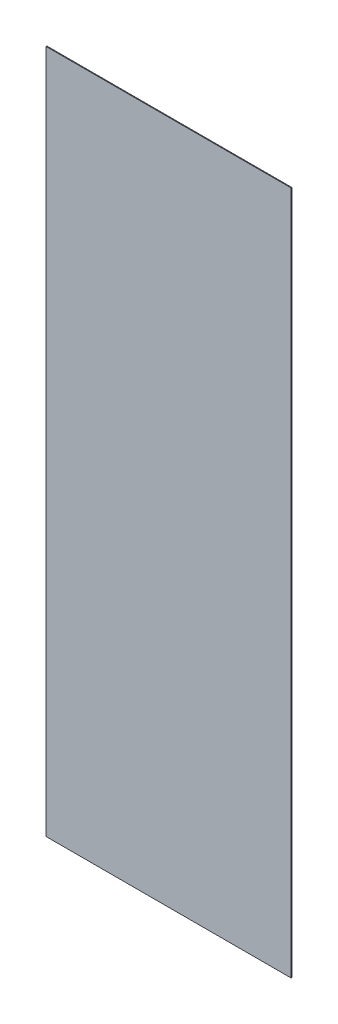
ISO-10303-21;
HEADER;
FILE_DESCRIPTION(('STEP AP214'),'2;1');
FILE_NAME('part.step','',(''),(''),'','','');
FILE_SCHEMA(('AUTOMOTIVE_DESIGN { 1 0 10303 214 1 1 1 1 }'));
ENDSEC;
DATA;
#1=APPLICATION_CONTEXT('core data for automotive mechanical design processes');
#2=APPLICATION_PROTOCOL_DEFINITION('international standard','automotive_design',2000,#1);
#3=PRODUCT_CONTEXT('',#1,'mechanical');
#4=PRODUCT('Part','Part','',(#3));
#5=PRODUCT_RELATED_PRODUCT_CATEGORY('part','',(#4));
#6=PRODUCT_DEFINITION_FORMATION('','',#4);
#7=PRODUCT_DEFINITION_CONTEXT('part definition',#1,'design');
#8=PRODUCT_DEFINITION('design','',#6,#7);
#9=PRODUCT_DEFINITION_SHAPE('','',#8);
#10=(LENGTH_UNIT() NAMED_UNIT(*) SI_UNIT(.MILLI.,.METRE.));
#11=(NAMED_UNIT(*) PLANE_ANGLE_UNIT() SI_UNIT($,.RADIAN.));
#12=(NAMED_UNIT(*) SI_UNIT($,.STERADIAN.) SOLID_ANGLE_UNIT());
#13=UNCERTAINTY_MEASURE_WITH_UNIT(LENGTH_MEASURE(1.E-05),#10,'distance_accuracy_value','');
#14=(GEOMETRIC_REPRESENTATION_CONTEXT(3) GLOBAL_UNCERTAINTY_ASSIGNED_CONTEXT((#13)) GLOBAL_UNIT_ASSIGNED_CONTEXT((#10,
#11,#12)) REPRESENTATION_CONTEXT('',''));
#15=CARTESIAN_POINT('',(0.,0.,0.));
#16=DIRECTION('',(0.,0.,1.));
#17=DIRECTION('',(1.,0.,0.));
#18=AXIS2_PLACEMENT_3D('',#15,#16,#17);
#19=CARTESIAN_POINT('',(42.5,242.5,-722.));
#20=DIRECTION('',(-1.,0.,0.));
#21=DIRECTION('',(0.,0.,1.));
#22=AXIS2_PLACEMENT_3D('',#19,#20,#21);
#23=PLANE('',#22);
#24=DIRECTION('',(0.,-1.,0.));
#25=VECTOR('',#24,1.);
#26=CARTESIAN_POINT('',(42.5,242.5,-720.));
#27=LINE('',#26,#25);
#28=CARTESIAN_POINT('',(42.5,1960.,-720.));
#29=VERTEX_POINT('',#28);
#30=CARTESIAN_POINT('',(42.5,242.5,-720.));
#31=VERTEX_POINT('',#30);
#32=EDGE_CURVE('E103',#29,#31,#27,.T.);
#33=ORIENTED_EDGE('',*,*,#32,.F.);
#34=DIRECTION('',(0.,0.,1.));
#35=VECTOR('',#34,1.);
#36=CARTESIAN_POINT('',(42.5,1960.,-722.));
#37=LINE('',#36,#35);
#38=CARTESIAN_POINT('',(42.5,1960.,-722.));
#39=VERTEX_POINT('',#38);
#40=EDGE_CURVE('E11',#39,#29,#37,.T.);
#41=ORIENTED_EDGE('',*,*,#40,.F.);
#42=DIRECTION('',(0.,-1.,0.));
#43=VECTOR('',#42,1.);
#44=CARTESIAN_POINT('',(42.5,242.5,-722.));
#45=LINE('',#44,#43);
#46=CARTESIAN_POINT('',(42.5,242.5,-722.));
#47=VERTEX_POINT('',#46);
#48=EDGE_CURVE('E97',#39,#47,#45,.T.);
#49=ORIENTED_EDGE('',*,*,#48,.T.);
#50=DIRECTION('',(0.,0.,1.));
#51=VECTOR('',#50,1.);
#52=CARTESIAN_POINT('',(42.5,242.5,-722.));
#53=LINE('',#52,#51);
#54=EDGE_CURVE('E42',#47,#31,#53,.T.);
#55=ORIENTED_EDGE('',*,*,#54,.T.);
#56=EDGE_LOOP('',(#33,#41,#49,#55));
#57=FACE_BOUND('',#56,.T.);
#58=ADVANCED_FACE('F39',(#57),#23,.T.);
#59=CARTESIAN_POINT('',(42.5,1960.,-722.));
#60=DIRECTION('',(0.,1.,0.));
#61=DIRECTION('',(0.,0.,1.));
#62=AXIS2_PLACEMENT_3D('',#59,#60,#61);
#63=PLANE('',#62);
#64=DIRECTION('',(-1.,0.,0.));
#65=VECTOR('',#64,1.);
#66=CARTESIAN_POINT('',(42.5,1960.,-720.));
#67=LINE('',#66,#65);
#68=CARTESIAN_POINT('',(657.5,1960.,-720.));
#69=VERTEX_POINT('',#68);
#70=EDGE_CURVE('E99',#69,#29,#67,.T.);
#71=ORIENTED_EDGE('',*,*,#70,.F.);
#72=DIRECTION('',(0.,0.,1.));
#73=VECTOR('',#72,1.);
#74=CARTESIAN_POINT('',(657.5,1960.,-722.));
#75=LINE('',#74,#73);
#76=CARTESIAN_POINT('',(657.5,1960.,-722.));
#77=VERTEX_POINT('',#76);
#78=EDGE_CURVE('E48',#77,#69,#75,.T.);
#79=ORIENTED_EDGE('',*,*,#78,.F.);
#80=DIRECTION('',(-1.,0.,0.));
#81=VECTOR('',#80,1.);
#82=CARTESIAN_POINT('',(42.5,1960.,-722.));
#83=LINE('',#82,#81);
#84=EDGE_CURVE('E94',#77,#39,#83,.T.);
#85=ORIENTED_EDGE('',*,*,#84,.T.);
#86=ORIENTED_EDGE('',*,*,#40,.T.);
#87=EDGE_LOOP('',(#71,#79,#85,#86));
#88=FACE_BOUND('',#87,.T.);
#89=ADVANCED_FACE('F113',(#88),#63,.T.);
#90=CARTESIAN_POINT('',(657.5,242.5,-722.));
#91=DIRECTION('',(1.,0.,0.));
#92=DIRECTION('',(0.,0.,-1.));
#93=AXIS2_PLACEMENT_3D('',#90,#91,#92);
#94=PLANE('',#93);
#95=DIRECTION('',(0.,1.,0.));
#96=VECTOR('',#95,1.);
#97=CARTESIAN_POINT('',(657.5,242.5,-720.));
#98=LINE('',#97,#96);
#99=CARTESIAN_POINT('',(657.5,242.5,-720.));
#100=VERTEX_POINT('',#99);
#101=EDGE_CURVE('E89',#100,#69,#98,.T.);
#102=ORIENTED_EDGE('',*,*,#101,.F.);
#103=DIRECTION('',(0.,0.,1.));
#104=VECTOR('',#103,1.);
#105=CARTESIAN_POINT('',(657.5,242.5,-722.));
#106=LINE('',#105,#104);
#107=CARTESIAN_POINT('',(657.5,242.5,-722.));
#108=VERTEX_POINT('',#107);
#109=EDGE_CURVE('E84',#108,#100,#106,.T.);
#110=ORIENTED_EDGE('',*,*,#109,.F.);
#111=DIRECTION('',(0.,1.,0.));
#112=VECTOR('',#111,1.);
#113=CARTESIAN_POINT('',(657.5,242.5,-722.));
#114=LINE('',#113,#112);
#115=EDGE_CURVE('E87',#108,#77,#114,.T.);
#116=ORIENTED_EDGE('',*,*,#115,.T.);
#117=ORIENTED_EDGE('',*,*,#78,.T.);
#118=EDGE_LOOP('',(#102,#110,#116,#117));
#119=FACE_BOUND('',#118,.T.);
#120=ADVANCED_FACE('F86',(#119),#94,.T.);
#121=CARTESIAN_POINT('',(42.5,242.5,-722.));
#122=DIRECTION('',(0.,-1.,0.));
#123=DIRECTION('',(0.,0.,-1.));
#124=AXIS2_PLACEMENT_3D('',#121,#122,#123);
#125=PLANE('',#124);
#126=DIRECTION('',(1.,0.,0.));
#127=VECTOR('',#126,1.);
#128=CARTESIAN_POINT('',(42.5,242.5,-720.));
#129=LINE('',#128,#127);
#130=EDGE_CURVE('E106',#31,#100,#129,.T.);
#131=ORIENTED_EDGE('',*,*,#130,.F.);
#132=ORIENTED_EDGE('',*,*,#54,.F.);
#133=DIRECTION('',(1.,0.,0.));
#134=VECTOR('',#133,1.);
#135=CARTESIAN_POINT('',(42.5,242.5,-722.));
#136=LINE('',#135,#134);
#137=EDGE_CURVE('E93',#47,#108,#136,.T.);
#138=ORIENTED_EDGE('',*,*,#137,.T.);
#139=ORIENTED_EDGE('',*,*,#109,.T.);
#140=EDGE_LOOP('',(#131,#132,#138,#139));
#141=FACE_BOUND('',#140,.T.);
#142=ADVANCED_FACE('F96',(#141),#125,.T.);
#143=CARTESIAN_POINT('',(0.,0.,-722.));
#144=DIRECTION('',(0.,0.,-1.));
#145=DIRECTION('',(-1.,0.,0.));
#146=AXIS2_PLACEMENT_3D('',#143,#144,#145);
#147=PLANE('',#146);
#148=ORIENTED_EDGE('',*,*,#48,.F.);
#149=ORIENTED_EDGE('',*,*,#84,.F.);
#150=ORIENTED_EDGE('',*,*,#115,.F.);
#151=ORIENTED_EDGE('',*,*,#137,.F.);
#152=EDGE_LOOP('',(#148,#149,#150,#151));
#153=FACE_BOUND('',#152,.T.);
#154=ADVANCED_FACE('F92',(#153),#147,.T.);
#155=CARTESIAN_POINT('',(0.,0.,-720.));
#156=DIRECTION('',(0.,0.,-1.));
#157=DIRECTION('',(-1.,0.,0.));
#158=AXIS2_PLACEMENT_3D('',#155,#156,#157);
#159=PLANE('',#158);
#160=ORIENTED_EDGE('',*,*,#32,.T.);
#161=ORIENTED_EDGE('',*,*,#130,.T.);
#162=ORIENTED_EDGE('',*,*,#101,.T.);
#163=ORIENTED_EDGE('',*,*,#70,.T.);
#164=EDGE_LOOP('',(#160,#161,#162,#163));
#165=FACE_BOUND('',#164,.T.);
#166=ADVANCED_FACE('F112',(#165),#159,.F.);
#167=CLOSED_SHELL('',(#58,#89,#120,#142,#154,#166));
#168=MANIFOLD_SOLID_BREP('B2',#167);
#169=ADVANCED_BREP_SHAPE_REPRESENTATION('',(#18,#168),#14);
#170=SHAPE_DEFINITION_REPRESENTATION(#9,#169);
ENDSEC;
END-ISO-10303-21;
